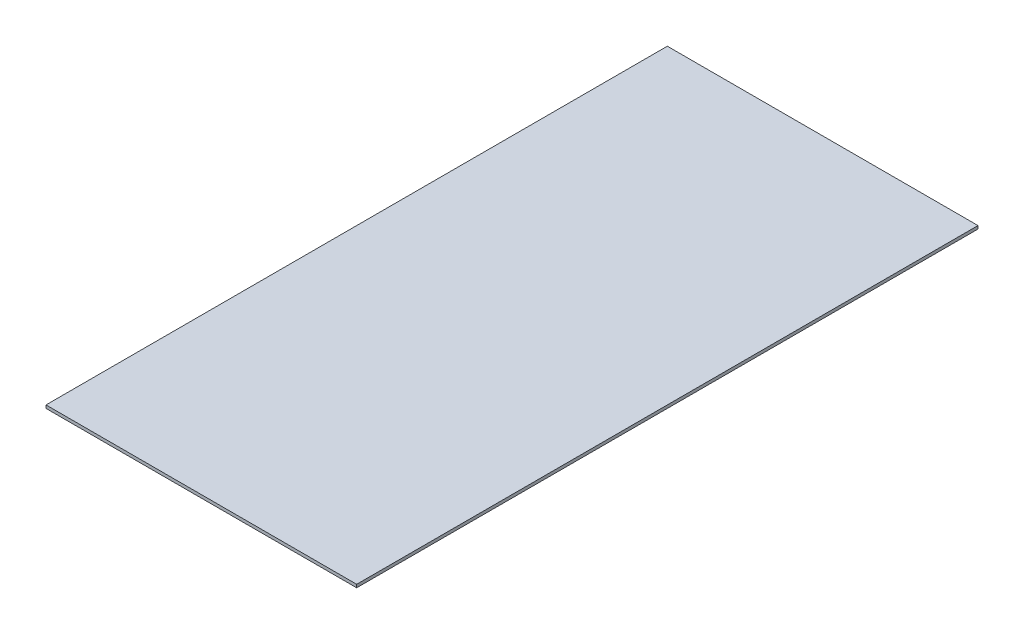
ISO-10303-21;
HEADER;
FILE_DESCRIPTION(('STEP AP214'),'2;1');
FILE_NAME('part.step','',(''),(''),'','','');
FILE_SCHEMA(('AUTOMOTIVE_DESIGN { 1 0 10303 214 1 1 1 1 }'));
ENDSEC;
DATA;
#1=APPLICATION_CONTEXT('core data for automotive mechanical design processes');
#2=APPLICATION_PROTOCOL_DEFINITION('international standard','automotive_design',2000,#1);
#3=PRODUCT_CONTEXT('',#1,'mechanical');
#4=PRODUCT('Part','Part','',(#3));
#5=PRODUCT_RELATED_PRODUCT_CATEGORY('part','',(#4));
#6=PRODUCT_DEFINITION_FORMATION('','',#4);
#7=PRODUCT_DEFINITION_CONTEXT('part definition',#1,'design');
#8=PRODUCT_DEFINITION('design','',#6,#7);
#9=PRODUCT_DEFINITION_SHAPE('','',#8);
#10=(LENGTH_UNIT() NAMED_UNIT(*) SI_UNIT(.MILLI.,.METRE.));
#11=(NAMED_UNIT(*) PLANE_ANGLE_UNIT() SI_UNIT($,.RADIAN.));
#12=(NAMED_UNIT(*) SI_UNIT($,.STERADIAN.) SOLID_ANGLE_UNIT());
#13=UNCERTAINTY_MEASURE_WITH_UNIT(LENGTH_MEASURE(1.E-05),#10,'distance_accuracy_value','');
#14=(GEOMETRIC_REPRESENTATION_CONTEXT(3) GLOBAL_UNCERTAINTY_ASSIGNED_CONTEXT((#13)) GLOBAL_UNIT_ASSIGNED_CONTEXT((#10,
#11,#12)) REPRESENTATION_CONTEXT('',''));
#15=CARTESIAN_POINT('',(0.,0.,0.));
#16=DIRECTION('',(0.,0.,1.));
#17=DIRECTION('',(1.,0.,0.));
#18=AXIS2_PLACEMENT_3D('',#15,#16,#17);
#19=CARTESIAN_POINT('',(0.,12.,0.));
#20=DIRECTION('',(1.,0.,0.));
#21=DIRECTION('',(0.,0.,-1.));
#22=AXIS2_PLACEMENT_3D('',#19,#20,#21);
#23=PLANE('',#22);
#24=DIRECTION('',(0.,0.,1.));
#25=VECTOR('',#24,1.);
#26=CARTESIAN_POINT('',(0.,0.,0.));
#27=LINE('',#26,#25);
#28=CARTESIAN_POINT('',(0.,0.,-2438.4));
#29=VERTEX_POINT('',#28);
#30=CARTESIAN_POINT('',(0.,0.,0.));
#31=VERTEX_POINT('',#30);
#32=EDGE_CURVE('E95',#29,#31,#27,.T.);
#33=ORIENTED_EDGE('',*,*,#32,.T.);
#34=DIRECTION('',(0.,-1.,0.));
#35=VECTOR('',#34,1.);
#36=CARTESIAN_POINT('',(0.,12.,0.));
#37=LINE('',#36,#35);
#38=CARTESIAN_POINT('',(0.,12.,0.));
#39=VERTEX_POINT('',#38);
#40=EDGE_CURVE('E11',#39,#31,#37,.T.);
#41=ORIENTED_EDGE('',*,*,#40,.F.);
#42=DIRECTION('',(0.,0.,1.));
#43=VECTOR('',#42,1.);
#44=CARTESIAN_POINT('',(0.,12.,0.));
#45=LINE('',#44,#43);
#46=CARTESIAN_POINT('',(0.,12.,-2438.4));
#47=VERTEX_POINT('',#46);
#48=EDGE_CURVE('E83',#47,#39,#45,.T.);
#49=ORIENTED_EDGE('',*,*,#48,.F.);
#50=DIRECTION('',(0.,-1.,0.));
#51=VECTOR('',#50,1.);
#52=CARTESIAN_POINT('',(0.,12.,-2438.4));
#53=LINE('',#52,#51);
#54=EDGE_CURVE('E91',#47,#29,#53,.T.);
#55=ORIENTED_EDGE('',*,*,#54,.T.);
#56=EDGE_LOOP('',(#33,#41,#49,#55));
#57=FACE_BOUND('',#56,.T.);
#58=ADVANCED_FACE('F32',(#57),#23,.F.);
#59=CARTESIAN_POINT('',(0.,12.,0.));
#60=DIRECTION('',(0.,0.,-1.));
#61=DIRECTION('',(-1.,0.,0.));
#62=AXIS2_PLACEMENT_3D('',#59,#60,#61);
#63=PLANE('',#62);
#64=DIRECTION('',(1.,0.,0.));
#65=VECTOR('',#64,1.);
#66=CARTESIAN_POINT('',(0.,0.,0.));
#67=LINE('',#66,#65);
#68=CARTESIAN_POINT('',(1219.2,0.,0.));
#69=VERTEX_POINT('',#68);
#70=EDGE_CURVE('E87',#31,#69,#67,.T.);
#71=ORIENTED_EDGE('',*,*,#70,.T.);
#72=DIRECTION('',(0.,-1.,0.));
#73=VECTOR('',#72,1.);
#74=CARTESIAN_POINT('',(1219.2,12.,0.));
#75=LINE('',#74,#73);
#76=CARTESIAN_POINT('',(1219.2,12.,0.));
#77=VERTEX_POINT('',#76);
#78=EDGE_CURVE('E40',#77,#69,#75,.T.);
#79=ORIENTED_EDGE('',*,*,#78,.F.);
#80=DIRECTION('',(1.,0.,0.));
#81=VECTOR('',#80,1.);
#82=CARTESIAN_POINT('',(0.,12.,0.));
#83=LINE('',#82,#81);
#84=EDGE_CURVE('E78',#39,#77,#83,.T.);
#85=ORIENTED_EDGE('',*,*,#84,.F.);
#86=ORIENTED_EDGE('',*,*,#40,.T.);
#87=EDGE_LOOP('',(#71,#79,#85,#86));
#88=FACE_BOUND('',#87,.T.);
#89=ADVANCED_FACE('F86',(#88),#63,.F.);
#90=CARTESIAN_POINT('',(1219.2,12.,0.));
#91=DIRECTION('',(-1.,0.,0.));
#92=DIRECTION('',(0.,0.,1.));
#93=AXIS2_PLACEMENT_3D('',#90,#91,#92);
#94=PLANE('',#93);
#95=DIRECTION('',(0.,0.,-1.));
#96=VECTOR('',#95,1.);
#97=CARTESIAN_POINT('',(1219.2,0.,0.));
#98=LINE('',#97,#96);
#99=CARTESIAN_POINT('',(1219.2,0.,-2438.4));
#100=VERTEX_POINT('',#99);
#101=EDGE_CURVE('E65',#69,#100,#98,.T.);
#102=ORIENTED_EDGE('',*,*,#101,.T.);
#103=DIRECTION('',(0.,-1.,0.));
#104=VECTOR('',#103,1.);
#105=CARTESIAN_POINT('',(1219.2,12.,-2438.4));
#106=LINE('',#105,#104);
#107=CARTESIAN_POINT('',(1219.2,12.,-2438.4));
#108=VERTEX_POINT('',#107);
#109=EDGE_CURVE('E88',#108,#100,#106,.T.);
#110=ORIENTED_EDGE('',*,*,#109,.F.);
#111=DIRECTION('',(0.,0.,-1.));
#112=VECTOR('',#111,1.);
#113=CARTESIAN_POINT('',(1219.2,12.,0.));
#114=LINE('',#113,#112);
#115=EDGE_CURVE('E81',#77,#108,#114,.T.);
#116=ORIENTED_EDGE('',*,*,#115,.F.);
#117=ORIENTED_EDGE('',*,*,#78,.T.);
#118=EDGE_LOOP('',(#102,#110,#116,#117));
#119=FACE_BOUND('',#118,.T.);
#120=ADVANCED_FACE('F89',(#119),#94,.F.);
#121=CARTESIAN_POINT('',(0.,12.,-2438.4));
#122=DIRECTION('',(0.,0.,1.));
#123=DIRECTION('',(1.,0.,0.));
#124=AXIS2_PLACEMENT_3D('',#121,#122,#123);
#125=PLANE('',#124);
#126=DIRECTION('',(-1.,0.,0.));
#127=VECTOR('',#126,1.);
#128=CARTESIAN_POINT('',(0.,0.,-2438.4));
#129=LINE('',#128,#127);
#130=EDGE_CURVE('E71',#100,#29,#129,.T.);
#131=ORIENTED_EDGE('',*,*,#130,.T.);
#132=ORIENTED_EDGE('',*,*,#54,.F.);
#133=DIRECTION('',(-1.,0.,0.));
#134=VECTOR('',#133,1.);
#135=CARTESIAN_POINT('',(0.,12.,-2438.4));
#136=LINE('',#135,#134);
#137=EDGE_CURVE('E48',#108,#47,#136,.T.);
#138=ORIENTED_EDGE('',*,*,#137,.F.);
#139=ORIENTED_EDGE('',*,*,#109,.T.);
#140=EDGE_LOOP('',(#131,#132,#138,#139));
#141=FACE_BOUND('',#140,.T.);
#142=ADVANCED_FACE('F102',(#141),#125,.F.);
#143=CARTESIAN_POINT('',(0.,12.,0.));
#144=DIRECTION('',(0.,-1.,0.));
#145=DIRECTION('',(0.,0.,-1.));
#146=AXIS2_PLACEMENT_3D('',#143,#144,#145);
#147=PLANE('',#146);
#148=ORIENTED_EDGE('',*,*,#48,.T.);
#149=ORIENTED_EDGE('',*,*,#84,.T.);
#150=ORIENTED_EDGE('',*,*,#115,.T.);
#151=ORIENTED_EDGE('',*,*,#137,.T.);
#152=EDGE_LOOP('',(#148,#149,#150,#151));
#153=FACE_BOUND('',#152,.T.);
#154=ADVANCED_FACE('F79',(#153),#147,.F.);
#155=CARTESIAN_POINT('',(0.,0.,0.));
#156=DIRECTION('',(0.,-1.,0.));
#157=DIRECTION('',(0.,0.,-1.));
#158=AXIS2_PLACEMENT_3D('',#155,#156,#157);
#159=PLANE('',#158);
#160=ORIENTED_EDGE('',*,*,#32,.F.);
#161=ORIENTED_EDGE('',*,*,#130,.F.);
#162=ORIENTED_EDGE('',*,*,#101,.F.);
#163=ORIENTED_EDGE('',*,*,#70,.F.);
#164=EDGE_LOOP('',(#160,#161,#162,#163));
#165=FACE_BOUND('',#164,.T.);
#166=ADVANCED_FACE('F105',(#165),#159,.T.);
#167=CLOSED_SHELL('',(#58,#89,#120,#142,#154,#166));
#168=MANIFOLD_SOLID_BREP('B2',#167);
#169=ADVANCED_BREP_SHAPE_REPRESENTATION('',(#18,#168),#14);
#170=SHAPE_DEFINITION_REPRESENTATION(#9,#169);
ENDSEC;
END-ISO-10303-21;
